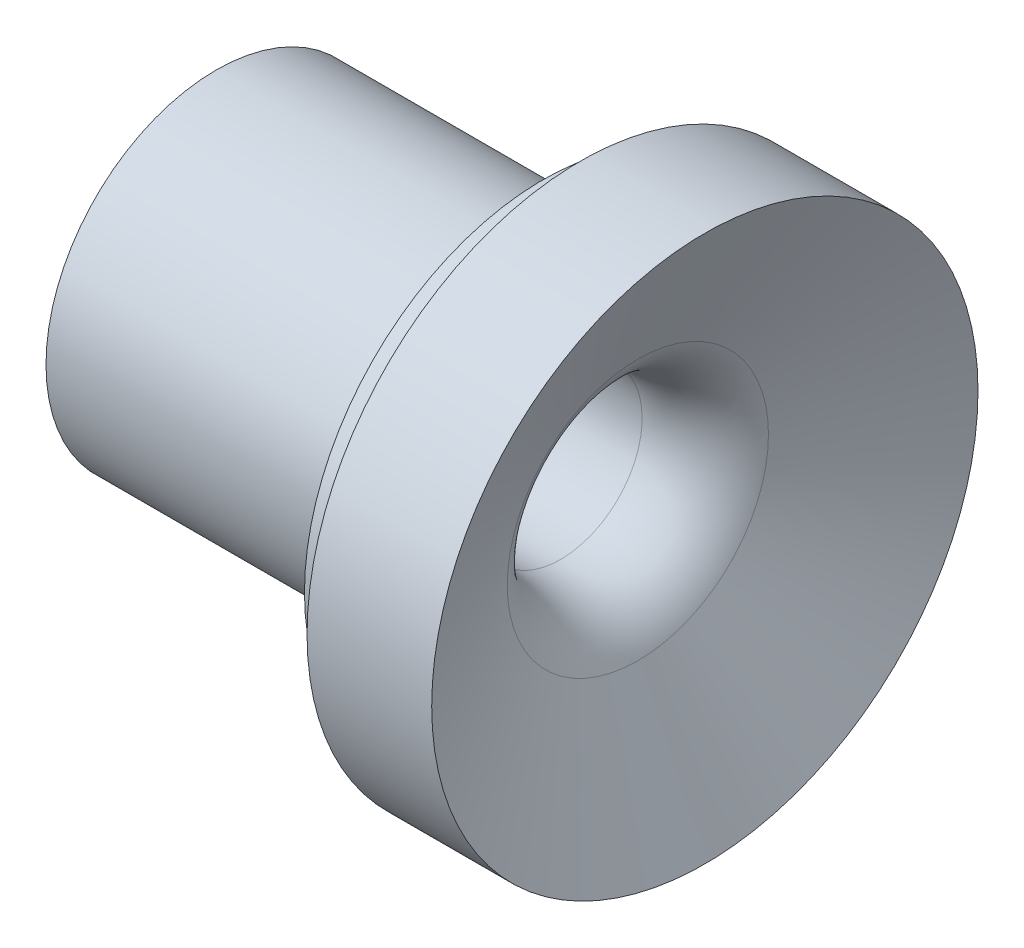
ISO-10303-21;
HEADER;
FILE_DESCRIPTION(('STEP AP214'),'2;1');
FILE_NAME('part.step','',(''),(''),'','','');
FILE_SCHEMA(('AUTOMOTIVE_DESIGN { 1 0 10303 214 1 1 1 1 }'));
ENDSEC;
DATA;
#1=APPLICATION_CONTEXT('core data for automotive mechanical design processes');
#2=APPLICATION_PROTOCOL_DEFINITION('international standard','automotive_design',2000,#1);
#3=PRODUCT_CONTEXT('',#1,'mechanical');
#4=PRODUCT('Part','Part','',(#3));
#5=PRODUCT_RELATED_PRODUCT_CATEGORY('part','',(#4));
#6=PRODUCT_DEFINITION_FORMATION('','',#4);
#7=PRODUCT_DEFINITION_CONTEXT('part definition',#1,'design');
#8=PRODUCT_DEFINITION('design','',#6,#7);
#9=PRODUCT_DEFINITION_SHAPE('','',#8);
#10=(LENGTH_UNIT() NAMED_UNIT(*) SI_UNIT(.MILLI.,.METRE.));
#11=(NAMED_UNIT(*) PLANE_ANGLE_UNIT() SI_UNIT($,.RADIAN.));
#12=(NAMED_UNIT(*) SI_UNIT($,.STERADIAN.) SOLID_ANGLE_UNIT());
#13=UNCERTAINTY_MEASURE_WITH_UNIT(LENGTH_MEASURE(1.E-05),#10,'distance_accuracy_value','');
#14=(GEOMETRIC_REPRESENTATION_CONTEXT(3) GLOBAL_UNCERTAINTY_ASSIGNED_CONTEXT((#13)) GLOBAL_UNIT_ASSIGNED_CONTEXT((#10,
#11,#12)) REPRESENTATION_CONTEXT('',''));
#15=CARTESIAN_POINT('',(0.,0.,0.));
#16=DIRECTION('',(0.,0.,1.));
#17=DIRECTION('',(1.,0.,0.));
#18=AXIS2_PLACEMENT_3D('',#15,#16,#17);
#19=CARTESIAN_POINT('',(1.98165682064434,7.34597735992569,0.));
#20=DIRECTION('',(1.,0.,0.));
#21=DIRECTION('',(0.,0.,-1.));
#22=AXIS2_PLACEMENT_3D('',#19,#20,#21);
#23=PLANE('',#22);
#24=CARTESIAN_POINT('',(1.98165682064434,-3.82202264007431,0.));
#25=DIRECTION('',(-1.,0.,0.));
#26=DIRECTION('',(0.,0.,1.));
#27=AXIS2_PLACEMENT_3D('',#24,#25,#26);
#28=CIRCLE('',#27,11.168);
#29=CARTESIAN_POINT('',(1.98165682064434,-3.82202264007431,11.168));
#30=VERTEX_POINT('',#29);
#31=EDGE_CURVE('E73',#30,#30,#28,.T.);
#32=ORIENTED_EDGE('',*,*,#31,.F.);
#33=EDGE_LOOP('',(#32));
#34=FACE_BOUND('',#33,.T.);
#35=CARTESIAN_POINT('',(1.98165682064434,-3.82202264007431,0.));
#36=DIRECTION('',(-1.,0.,0.));
#37=DIRECTION('',(0.,0.,1.));
#38=AXIS2_PLACEMENT_3D('',#35,#36,#37);
#39=CIRCLE('',#38,12.8);
#40=CARTESIAN_POINT('',(1.98165682064434,-3.82202264007431,12.8));
#41=VERTEX_POINT('',#40);
#42=EDGE_CURVE('E10',#41,#41,#39,.T.);
#43=ORIENTED_EDGE('',*,*,#42,.T.);
#44=EDGE_LOOP('',(#43));
#45=FACE_BOUND('',#44,.T.);
#46=ADVANCED_FACE('F30',(#34,#45),#23,.F.);
#47=CARTESIAN_POINT('',(-19.4769476737377,-3.82202264007431,0.));
#48=DIRECTION('',(-1.,0.,0.));
#49=DIRECTION('',(0.,0.,1.));
#50=AXIS2_PLACEMENT_3D('',#47,#48,#49);
#51=CYLINDRICAL_SURFACE('',#50,12.8);
#52=ORIENTED_EDGE('',*,*,#42,.F.);
#53=EDGE_LOOP('',(#52));
#54=FACE_BOUND('',#53,.T.);
#55=CARTESIAN_POINT('',(7.82345682064434,-3.82202264007431,0.));
#56=DIRECTION('',(-1.,0.,0.));
#57=DIRECTION('',(0.,0.,1.));
#58=AXIS2_PLACEMENT_3D('',#55,#56,#57);
#59=CIRCLE('',#58,12.8);
#60=CARTESIAN_POINT('',(7.82345682064434,-3.82202264007431,12.8));
#61=VERTEX_POINT('',#60);
#62=EDGE_CURVE('E36',#61,#61,#59,.T.);
#63=ORIENTED_EDGE('',*,*,#62,.T.);
#64=EDGE_LOOP('',(#63));
#65=FACE_BOUND('',#64,.T.);
#66=ADVANCED_FACE('F80',(#54,#65),#51,.T.);
#67=CARTESIAN_POINT('',(4.68381321816911,-3.82202264007431,0.));
#68=DIRECTION('',(1.,0.,0.));
#69=DIRECTION('',(0.,0.,-1.));
#70=AXIS2_PLACEMENT_3D('',#67,#68,#69);
#71=CONICAL_SURFACE('',#70,6.12046227932272,1.13140345075348);
#72=ORIENTED_EDGE('',*,*,#62,.F.);
#73=EDGE_LOOP('',(#72));
#74=FACE_BOUND('',#73,.T.);
#75=CARTESIAN_POINT('',(4.68381321816911,-3.82202264007431,0.));
#76=DIRECTION('',(-1.,0.,0.));
#77=DIRECTION('',(0.,0.,1.));
#78=AXIS2_PLACEMENT_3D('',#75,#76,#77);
#79=CIRCLE('',#78,6.12046227932272);
#80=CARTESIAN_POINT('',(4.68381321816911,-3.82202264007431,6.12046227932272));
#81=VERTEX_POINT('',#80);
#82=EDGE_CURVE('E40',#81,#81,#79,.T.);
#83=ORIENTED_EDGE('',*,*,#82,.T.);
#84=EDGE_LOOP('',(#83));
#85=FACE_BOUND('',#84,.T.);
#86=ADVANCED_FACE('F84',(#74,#85),#71,.F.);
#87=CARTESIAN_POINT('',(1.06377284011821,-3.82202264007431,0.));
#88=DIRECTION('',(-1.,0.,0.));
#89=DIRECTION('',(0.,0.,1.));
#90=AXIS2_PLACEMENT_3D('',#87,#88,#89);
#91=TOROIDAL_SURFACE('',#90,7.82202264007431,4.);
#92=ORIENTED_EDGE('',*,*,#82,.F.);
#93=EDGE_LOOP('',(#92));
#94=FACE_BOUND('',#93,.T.);
#95=CARTESIAN_POINT('',(1.06377284011821,-3.82202264007431,0.));
#96=DIRECTION('',(-1.,0.,0.));
#97=DIRECTION('',(0.,0.,1.));
#98=AXIS2_PLACEMENT_3D('',#95,#96,#97);
#99=CIRCLE('',#98,3.82202264007431);
#100=CARTESIAN_POINT('',(1.06377284011821,-3.82202264007431,3.82202264007431));
#101=VERTEX_POINT('',#100);
#102=EDGE_CURVE('E44',#101,#101,#99,.T.);
#103=ORIENTED_EDGE('',*,*,#102,.T.);
#104=EDGE_LOOP('',(#103));
#105=FACE_BOUND('',#104,.T.);
#106=ADVANCED_FACE('F89',(#94,#105),#91,.T.);
#107=CARTESIAN_POINT('',(-19.4769476737377,-3.82202264007431,0.));
#108=DIRECTION('',(-1.,0.,0.));
#109=DIRECTION('',(0.,0.,1.));
#110=AXIS2_PLACEMENT_3D('',#107,#108,#109);
#111=CYLINDRICAL_SURFACE('',#110,3.82202264007431);
#112=ORIENTED_EDGE('',*,*,#102,.F.);
#113=EDGE_LOOP('',(#112));
#114=FACE_BOUND('',#113,.T.);
#115=CARTESIAN_POINT('',(-5.03654317935566,-3.82202264007431,0.));
#116=DIRECTION('',(-1.,0.,0.));
#117=DIRECTION('',(0.,0.,1.));
#118=AXIS2_PLACEMENT_3D('',#115,#116,#117);
#119=CIRCLE('',#118,3.82202264007431);
#120=CARTESIAN_POINT('',(-5.03654317935566,-3.82202264007431,3.82202264007431));
#121=VERTEX_POINT('',#120);
#122=EDGE_CURVE('E49',#121,#121,#119,.T.);
#123=ORIENTED_EDGE('',*,*,#122,.T.);
#124=EDGE_LOOP('',(#123));
#125=FACE_BOUND('',#124,.T.);
#126=ADVANCED_FACE('F95',(#114,#125),#111,.F.);
#127=CARTESIAN_POINT('',(-15.0765431793557,-3.82202264007431,0.));
#128=DIRECTION('',(-1.,0.,0.));
#129=DIRECTION('',(0.,0.,1.));
#130=AXIS2_PLACEMENT_3D('',#127,#128,#129);
#131=CONICAL_SURFACE('',#130,5.638,0.178939611606282);
#132=ORIENTED_EDGE('',*,*,#122,.F.);
#133=EDGE_LOOP('',(#132));
#134=FACE_BOUND('',#133,.T.);
#135=CARTESIAN_POINT('',(-15.0765431793557,-3.82202264007431,0.));
#136=DIRECTION('',(-1.,0.,0.));
#137=DIRECTION('',(0.,0.,1.));
#138=AXIS2_PLACEMENT_3D('',#135,#136,#137);
#139=CIRCLE('',#138,5.638);
#140=CARTESIAN_POINT('',(-15.0765431793557,-3.82202264007431,5.638));
#141=VERTEX_POINT('',#140);
#142=EDGE_CURVE('E52',#141,#141,#139,.T.);
#143=ORIENTED_EDGE('',*,*,#142,.T.);
#144=EDGE_LOOP('',(#143));
#145=FACE_BOUND('',#144,.T.);
#146=ADVANCED_FACE('F99',(#134,#145),#131,.F.);
#147=CARTESIAN_POINT('',(-15.0765431793557,1.81597735992569,0.));
#148=DIRECTION('',(1.,0.,0.));
#149=DIRECTION('',(0.,0.,-1.));
#150=AXIS2_PLACEMENT_3D('',#147,#148,#149);
#151=PLANE('',#150);
#152=ORIENTED_EDGE('',*,*,#142,.F.);
#153=EDGE_LOOP('',(#152));
#154=FACE_BOUND('',#153,.T.);
#155=CARTESIAN_POINT('',(-15.0765431793557,-3.82202264007431,0.));
#156=DIRECTION('',(-1.,0.,0.));
#157=DIRECTION('',(0.,0.,1.));
#158=AXIS2_PLACEMENT_3D('',#155,#156,#157);
#159=CIRCLE('',#158,7.974);
#160=CARTESIAN_POINT('',(-15.0765431793557,-3.82202264007431,7.974));
#161=VERTEX_POINT('',#160);
#162=EDGE_CURVE('E55',#161,#161,#159,.T.);
#163=ORIENTED_EDGE('',*,*,#162,.T.);
#164=EDGE_LOOP('',(#163));
#165=FACE_BOUND('',#164,.T.);
#166=ADVANCED_FACE('F103',(#154,#165),#151,.F.);
#167=CARTESIAN_POINT('',(-19.4769476737377,-3.82202264007431,0.));
#168=DIRECTION('',(-1.,0.,0.));
#169=DIRECTION('',(0.,0.,1.));
#170=AXIS2_PLACEMENT_3D('',#167,#168,#169);
#171=CYLINDRICAL_SURFACE('',#170,7.974);
#172=ORIENTED_EDGE('',*,*,#162,.F.);
#173=EDGE_LOOP('',(#172));
#174=FACE_BOUND('',#173,.T.);
#175=CARTESIAN_POINT('',(-2.00051341362187,-3.82202264007431,0.));
#176=DIRECTION('',(-1.,0.,0.));
#177=DIRECTION('',(0.,0.,1.));
#178=AXIS2_PLACEMENT_3D('',#175,#176,#177);
#179=CIRCLE('',#178,7.974);
#180=CARTESIAN_POINT('',(-2.00051341362187,-3.82202264007431,7.974));
#181=VERTEX_POINT('',#180);
#182=EDGE_CURVE('E58',#181,#181,#179,.T.);
#183=ORIENTED_EDGE('',*,*,#182,.T.);
#184=EDGE_LOOP('',(#183));
#185=FACE_BOUND('',#184,.T.);
#186=ADVANCED_FACE('F107',(#174,#185),#171,.T.);
#187=CARTESIAN_POINT('',(-2.00051341362187,-3.82202264007431,0.));
#188=DIRECTION('',(-1.,0.,0.));
#189=DIRECTION('',(0.,0.,1.));
#190=AXIS2_PLACEMENT_3D('',#187,#188,#189);
#191=TOROIDAL_SURFACE('',#190,8.974,1.);
#192=ORIENTED_EDGE('',*,*,#182,.F.);
#193=EDGE_LOOP('',(#192));
#194=FACE_BOUND('',#193,.T.);
#195=CARTESIAN_POINT('',(-1.35772580393533,-3.82202264007431,0.));
#196=DIRECTION('',(-1.,0.,0.));
#197=DIRECTION('',(0.,0.,1.));
#198=AXIS2_PLACEMENT_3D('',#195,#196,#197);
#199=CIRCLE('',#198,8.20795555688102);
#200=CARTESIAN_POINT('',(-1.35772580393533,-3.82202264007431,8.20795555688102));
#201=VERTEX_POINT('',#200);
#202=EDGE_CURVE('E61',#201,#201,#199,.T.);
#203=ORIENTED_EDGE('',*,*,#202,.T.);
#204=EDGE_LOOP('',(#203));
#205=FACE_BOUND('',#204,.T.);
#206=ADVANCED_FACE('F111',(#194,#205),#191,.F.);
#207=CARTESIAN_POINT('',(-0.128155569669122,-3.82202264007431,0.));
#208=DIRECTION('',(1.,0.,0.));
#209=DIRECTION('',(0.,0.,-1.));
#210=AXIS2_PLACEMENT_3D('',#207,#208,#209);
#211=CONICAL_SURFACE('',#210,9.23968748696036,0.698131700797733);
#212=ORIENTED_EDGE('',*,*,#202,.F.);
#213=EDGE_LOOP('',(#212));
#214=FACE_BOUND('',#213,.T.);
#215=CARTESIAN_POINT('',(-0.128155569669122,-3.82202264007431,0.));
#216=DIRECTION('',(-1.,0.,0.));
#217=DIRECTION('',(0.,0.,1.));
#218=AXIS2_PLACEMENT_3D('',#215,#216,#217);
#219=CIRCLE('',#218,9.23968748696036);
#220=CARTESIAN_POINT('',(-0.128155569669122,-3.82202264007431,9.23968748696036));
#221=VERTEX_POINT('',#220);
#222=EDGE_CURVE('E64',#221,#221,#219,.T.);
#223=ORIENTED_EDGE('',*,*,#222,.T.);
#224=EDGE_LOOP('',(#223));
#225=FACE_BOUND('',#224,.T.);
#226=ADVANCED_FACE('F115',(#214,#225),#211,.T.);
#227=CARTESIAN_POINT('',(-0.770943179355662,-3.82202264007431,0.));
#228=DIRECTION('',(-1.,0.,0.));
#229=DIRECTION('',(0.,0.,1.));
#230=AXIS2_PLACEMENT_3D('',#227,#228,#229);
#231=TOROIDAL_SURFACE('',#230,10.0057319300793,1.);
#232=ORIENTED_EDGE('',*,*,#222,.F.);
#233=EDGE_LOOP('',(#232));
#234=FACE_BOUND('',#233,.T.);
#235=CARTESIAN_POINT('',(0.229056820644339,-3.82202264007431,0.));
#236=DIRECTION('',(-1.,0.,0.));
#237=DIRECTION('',(0.,0.,1.));
#238=AXIS2_PLACEMENT_3D('',#235,#236,#237);
#239=CIRCLE('',#238,10.0057319300793);
#240=CARTESIAN_POINT('',(0.229056820644339,-3.82202264007431,10.0057319300793));
#241=VERTEX_POINT('',#240);
#242=EDGE_CURVE('E67',#241,#241,#239,.T.);
#243=ORIENTED_EDGE('',*,*,#242,.T.);
#244=EDGE_LOOP('',(#243));
#245=FACE_BOUND('',#244,.T.);
#246=ADVANCED_FACE('F119',(#234,#245),#231,.F.);
#247=CARTESIAN_POINT('',(0.229056820644339,6.18370929000503,0.));
#248=DIRECTION('',(1.,0.,0.));
#249=DIRECTION('',(0.,0.,-1.));
#250=AXIS2_PLACEMENT_3D('',#247,#248,#249);
#251=PLANE('',#250);
#252=ORIENTED_EDGE('',*,*,#242,.F.);
#253=EDGE_LOOP('',(#252));
#254=FACE_BOUND('',#253,.T.);
#255=CARTESIAN_POINT('',(0.229056820644339,-3.82202264007431,0.));
#256=DIRECTION('',(-1.,0.,0.));
#257=DIRECTION('',(0.,0.,1.));
#258=AXIS2_PLACEMENT_3D('',#255,#256,#257);
#259=CIRCLE('',#258,11.168);
#260=CARTESIAN_POINT('',(0.229056820644339,-3.82202264007431,11.168));
#261=VERTEX_POINT('',#260);
#262=EDGE_CURVE('E70',#261,#261,#259,.T.);
#263=ORIENTED_EDGE('',*,*,#262,.T.);
#264=EDGE_LOOP('',(#263));
#265=FACE_BOUND('',#264,.T.);
#266=ADVANCED_FACE('F123',(#254,#265),#251,.F.);
#267=CARTESIAN_POINT('',(-19.4769476737377,-3.82202264007431,0.));
#268=DIRECTION('',(-1.,0.,0.));
#269=DIRECTION('',(0.,0.,1.));
#270=AXIS2_PLACEMENT_3D('',#267,#268,#269);
#271=CYLINDRICAL_SURFACE('',#270,11.168);
#272=ORIENTED_EDGE('',*,*,#262,.F.);
#273=EDGE_LOOP('',(#272));
#274=FACE_BOUND('',#273,.T.);
#275=ORIENTED_EDGE('',*,*,#31,.T.);
#276=EDGE_LOOP('',(#275));
#277=FACE_BOUND('',#276,.T.);
#278=ADVANCED_FACE('F77',(#274,#277),#271,.T.);
#279=CLOSED_SHELL('',(#46,#66,#86,#106,#126,#146,#166,#186,#206,#226,#246,#266,#278));
#280=MANIFOLD_SOLID_BREP('B2',#279);
#281=ADVANCED_BREP_SHAPE_REPRESENTATION('',(#18,#280),#14);
#282=SHAPE_DEFINITION_REPRESENTATION(#9,#281);
ENDSEC;
END-ISO-10303-21;
